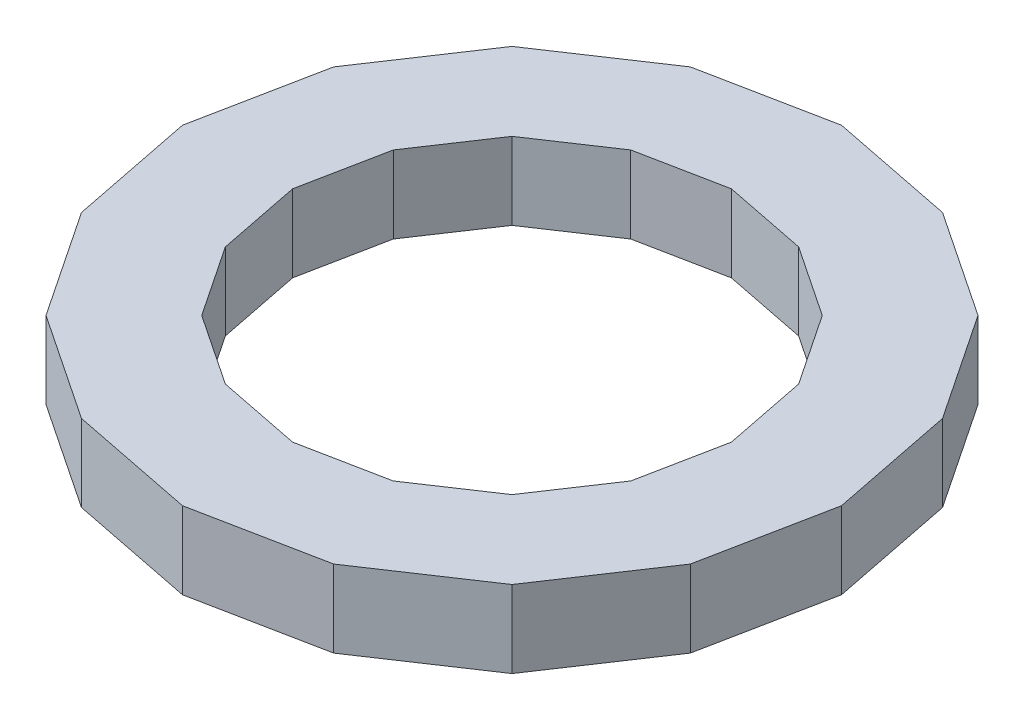
ISO-10303-21;
HEADER;
FILE_DESCRIPTION(('STEP AP214'),'2;1');
FILE_NAME('part.step','',(''),(''),'','','');
FILE_SCHEMA(('AUTOMOTIVE_DESIGN { 1 0 10303 214 1 1 1 1 }'));
ENDSEC;
DATA;
#1=APPLICATION_CONTEXT('core data for automotive mechanical design processes');
#2=APPLICATION_PROTOCOL_DEFINITION('international standard','automotive_design',2000,#1);
#3=PRODUCT_CONTEXT('',#1,'mechanical');
#4=PRODUCT('Part','Part','',(#3));
#5=PRODUCT_RELATED_PRODUCT_CATEGORY('part','',(#4));
#6=PRODUCT_DEFINITION_FORMATION('','',#4);
#7=PRODUCT_DEFINITION_CONTEXT('part definition',#1,'design');
#8=PRODUCT_DEFINITION('design','',#6,#7);
#9=PRODUCT_DEFINITION_SHAPE('','',#8);
#10=(LENGTH_UNIT() NAMED_UNIT(*) SI_UNIT(.MILLI.,.METRE.));
#11=(NAMED_UNIT(*) PLANE_ANGLE_UNIT() SI_UNIT($,.RADIAN.));
#12=(NAMED_UNIT(*) SI_UNIT($,.STERADIAN.) SOLID_ANGLE_UNIT());
#13=UNCERTAINTY_MEASURE_WITH_UNIT(LENGTH_MEASURE(1.E-05),#10,'distance_accuracy_value','');
#14=(GEOMETRIC_REPRESENTATION_CONTEXT(3) GLOBAL_UNCERTAINTY_ASSIGNED_CONTEXT((#13)) GLOBAL_UNIT_ASSIGNED_CONTEXT((#10,
#11,#12)) REPRESENTATION_CONTEXT('',''));
#15=CARTESIAN_POINT('',(0.,0.,0.));
#16=DIRECTION('',(0.,0.,1.));
#17=DIRECTION('',(1.,0.,0.));
#18=AXIS2_PLACEMENT_3D('',#15,#16,#17);
#19=CARTESIAN_POINT('',(0.,19.05,0.));
#20=DIRECTION('',(0.,1.,0.));
#21=DIRECTION('',(0.,0.,1.));
#22=AXIS2_PLACEMENT_3D('',#19,#20,#21);
#23=PLANE('',#22);
#24=DIRECTION('',(-0.195090322016128,0.,0.98078528040323));
#25=VECTOR('',#24,1.);
#26=CARTESIAN_POINT('',(-75.1784477417806,19.05,-31.1399326528026));
#27=LINE('',#26,#25);
#28=CARTESIAN_POINT('',(-75.1784477417806,19.05,-31.1399326528026));
#29=VERTEX_POINT('',#28);
#30=CARTESIAN_POINT('',(-81.3725654657927,19.05,0.));
#31=VERTEX_POINT('',#30);
#32=EDGE_CURVE('E364',#29,#31,#27,.T.);
#33=ORIENTED_EDGE('',*,*,#32,.T.);
#34=DIRECTION('',(0.195090322016128,0.,0.980785280403231));
#35=VECTOR('',#34,1.);
#36=CARTESIAN_POINT('',(-81.3725654657927,19.05,0.));
#37=LINE('',#36,#35);
#38=CARTESIAN_POINT('',(-75.1784477417806,19.05,31.1399326528025));
#39=VERTEX_POINT('',#38);
#40=EDGE_CURVE('E367',#31,#39,#37,.T.);
#41=ORIENTED_EDGE('',*,*,#40,.T.);
#42=DIRECTION('',(0.555570233019602,0.,0.831469612302545));
#43=VECTOR('',#42,1.);
#44=CARTESIAN_POINT('',(-75.1784477417806,19.05,31.1399326528025));
#45=LINE('',#44,#43);
#46=CARTESIAN_POINT('',(-57.5390928434083,19.05,57.5390928434082));
#47=VERTEX_POINT('',#46);
#48=EDGE_CURVE('E370',#39,#47,#45,.T.);
#49=ORIENTED_EDGE('',*,*,#48,.T.);
#50=DIRECTION('',(0.831469612302545,0.,0.555570233019603));
#51=VECTOR('',#50,1.);
#52=CARTESIAN_POINT('',(-57.5390928434083,19.05,57.5390928434082));
#53=LINE('',#52,#51);
#54=CARTESIAN_POINT('',(-31.1399326528025,19.05,75.1784477417806));
#55=VERTEX_POINT('',#54);
#56=EDGE_CURVE('E373',#47,#55,#53,.T.);
#57=ORIENTED_EDGE('',*,*,#56,.T.);
#58=DIRECTION('',(0.980785280403231,0.,0.195090322016128));
#59=VECTOR('',#58,1.);
#60=CARTESIAN_POINT('',(-31.1399326528025,19.05,75.1784477417806));
#61=LINE('',#60,#59);
#62=CARTESIAN_POINT('',(0.,19.05,81.3725654657926));
#63=VERTEX_POINT('',#62);
#64=EDGE_CURVE('E375',#55,#63,#61,.T.);
#65=ORIENTED_EDGE('',*,*,#64,.T.);
#66=DIRECTION('',(0.980785280403231,0.,-0.195090322016128));
#67=VECTOR('',#66,1.);
#68=CARTESIAN_POINT('',(0.,19.05,81.3725654657926));
#69=LINE('',#68,#67);
#70=CARTESIAN_POINT('',(31.1399326528025,19.05,75.1784477417806));
#71=VERTEX_POINT('',#70);
#72=EDGE_CURVE('E377',#63,#71,#69,.T.);
#73=ORIENTED_EDGE('',*,*,#72,.T.);
#74=DIRECTION('',(0.831469612302545,0.,-0.555570233019602));
#75=VECTOR('',#74,1.);
#76=CARTESIAN_POINT('',(31.1399326528025,19.05,75.1784477417806));
#77=LINE('',#76,#75);
#78=CARTESIAN_POINT('',(57.5390928434082,19.05,57.5390928434083));
#79=VERTEX_POINT('',#78);
#80=EDGE_CURVE('E379',#71,#79,#77,.T.);
#81=ORIENTED_EDGE('',*,*,#80,.T.);
#82=DIRECTION('',(0.555570233019603,0.,-0.831469612302545));
#83=VECTOR('',#82,1.);
#84=CARTESIAN_POINT('',(57.5390928434082,19.05,57.5390928434083));
#85=LINE('',#84,#83);
#86=CARTESIAN_POINT('',(75.1784477417806,19.05,31.1399326528025));
#87=VERTEX_POINT('',#86);
#88=EDGE_CURVE('E381',#79,#87,#85,.T.);
#89=ORIENTED_EDGE('',*,*,#88,.T.);
#90=DIRECTION('',(0.195090322016128,0.,-0.98078528040323));
#91=VECTOR('',#90,1.);
#92=CARTESIAN_POINT('',(75.1784477417806,19.05,31.1399326528025));
#93=LINE('',#92,#91);
#94=CARTESIAN_POINT('',(81.3725654657926,19.05,0.));
#95=VERTEX_POINT('',#94);
#96=EDGE_CURVE('E383',#87,#95,#93,.T.);
#97=ORIENTED_EDGE('',*,*,#96,.T.);
#98=DIRECTION('',(-0.195090322016128,0.,-0.98078528040323));
#99=VECTOR('',#98,1.);
#100=CARTESIAN_POINT('',(81.3725654657926,19.05,0.));
#101=LINE('',#100,#99);
#102=CARTESIAN_POINT('',(75.1784477417806,19.05,-31.1399326528025));
#103=VERTEX_POINT('',#102);
#104=EDGE_CURVE('E385',#95,#103,#101,.T.);
#105=ORIENTED_EDGE('',*,*,#104,.T.);
#106=DIRECTION('',(-0.555570233019602,0.,-0.831469612302545));
#107=VECTOR('',#106,1.);
#108=CARTESIAN_POINT('',(75.1784477417806,19.05,-31.1399326528025));
#109=LINE('',#108,#107);
#110=CARTESIAN_POINT('',(57.5390928434083,19.05,-57.5390928434082));
#111=VERTEX_POINT('',#110);
#112=EDGE_CURVE('E387',#103,#111,#109,.T.);
#113=ORIENTED_EDGE('',*,*,#112,.T.);
#114=DIRECTION('',(-0.831469612302545,0.,-0.555570233019603));
#115=VECTOR('',#114,1.);
#116=CARTESIAN_POINT('',(57.5390928434083,19.05,-57.5390928434082));
#117=LINE('',#116,#115);
#118=CARTESIAN_POINT('',(31.1399326528024,19.05,-75.1784477417806));
#119=VERTEX_POINT('',#118);
#120=EDGE_CURVE('E389',#111,#119,#117,.T.);
#121=ORIENTED_EDGE('',*,*,#120,.T.);
#122=DIRECTION('',(-0.980785280403231,0.,-0.195090322016128));
#123=VECTOR('',#122,1.);
#124=CARTESIAN_POINT('',(31.1399326528024,19.05,-75.1784477417806));
#125=LINE('',#124,#123);
#126=CARTESIAN_POINT('',(0.,19.05,-81.3725654657927));
#127=VERTEX_POINT('',#126);
#128=EDGE_CURVE('E391',#119,#127,#125,.T.);
#129=ORIENTED_EDGE('',*,*,#128,.T.);
#130=DIRECTION('',(-0.980785280403231,0.,0.195090322016127));
#131=VECTOR('',#130,1.);
#132=CARTESIAN_POINT('',(0.,19.05,-81.3725654657927));
#133=LINE('',#132,#131);
#134=CARTESIAN_POINT('',(-31.1399326528025,19.05,-75.1784477417806));
#135=VERTEX_POINT('',#134);
#136=EDGE_CURVE('E393',#127,#135,#133,.T.);
#137=ORIENTED_EDGE('',*,*,#136,.T.);
#138=DIRECTION('',(-0.831469612302546,0.,0.555570233019602));
#139=VECTOR('',#138,1.);
#140=CARTESIAN_POINT('',(-31.1399326528025,19.05,-75.1784477417806));
#141=LINE('',#140,#139);
#142=CARTESIAN_POINT('',(-57.5390928434082,19.05,-57.5390928434083));
#143=VERTEX_POINT('',#142);
#144=EDGE_CURVE('E395',#135,#143,#141,.T.);
#145=ORIENTED_EDGE('',*,*,#144,.T.);
#146=DIRECTION('',(-0.555570233019603,0.,0.831469612302545));
#147=VECTOR('',#146,1.);
#148=CARTESIAN_POINT('',(-57.5390928434082,19.05,-57.5390928434083));
#149=LINE('',#148,#147);
#150=EDGE_CURVE('E397',#143,#29,#149,.T.);
#151=ORIENTED_EDGE('',*,*,#150,.T.);
#152=EDGE_LOOP('',(#33,#41,#49,#57,#65,#73,#81,#89,#97,#105,#113,#121,#129,#137,#145,#151));
#153=FACE_BOUND('',#152,.T.);
#154=DIRECTION('',(0.195090322016128,0.,0.98078528040323));
#155=VECTOR('',#154,1.);
#156=CARTESIAN_POINT('',(-54.180069276377,19.05,0.));
#157=LINE('',#156,#155);
#158=CARTESIAN_POINT('',(-54.180069276377,19.05,0.));
#159=VERTEX_POINT('',#158);
#160=CARTESIAN_POINT('',(-50.0558570744883,19.05,20.7338148764623));
#161=VERTEX_POINT('',#160);
#162=EDGE_CURVE('E251',#159,#161,#157,.T.);
#163=ORIENTED_EDGE('',*,*,#162,.F.);
#164=DIRECTION('',(-0.195090322016128,0.,0.98078528040323));
#165=VECTOR('',#164,1.);
#166=CARTESIAN_POINT('',(-50.0558570744883,19.05,-20.7338148764623));
#167=LINE('',#166,#165);
#168=CARTESIAN_POINT('',(-50.0558570744883,19.05,-20.7338148764623));
#169=VERTEX_POINT('',#168);
#170=EDGE_CURVE('E243',#169,#159,#167,.T.);
#171=ORIENTED_EDGE('',*,*,#170,.F.);
#172=DIRECTION('',(-0.555570233019602,0.,0.831469612302546));
#173=VECTOR('',#172,1.);
#174=CARTESIAN_POINT('',(-38.3110943904831,19.05,-38.3110943904831));
#175=LINE('',#174,#173);
#176=CARTESIAN_POINT('',(-38.3110943904831,19.05,-38.3110943904831));
#177=VERTEX_POINT('',#176);
#178=EDGE_CURVE('E292',#177,#169,#175,.T.);
#179=ORIENTED_EDGE('',*,*,#178,.F.);
#180=DIRECTION('',(-0.831469612302545,0.,0.555570233019603));
#181=VECTOR('',#180,1.);
#182=CARTESIAN_POINT('',(-20.7338148764623,19.05,-50.0558570744883));
#183=LINE('',#182,#181);
#184=CARTESIAN_POINT('',(-20.7338148764623,19.05,-50.0558570744883));
#185=VERTEX_POINT('',#184);
#186=EDGE_CURVE('E290',#185,#177,#183,.T.);
#187=ORIENTED_EDGE('',*,*,#186,.F.);
#188=DIRECTION('',(-0.98078528040323,0.,0.195090322016129));
#189=VECTOR('',#188,1.);
#190=CARTESIAN_POINT('',(0.,19.05,-54.180069276377));
#191=LINE('',#190,#189);
#192=CARTESIAN_POINT('',(0.,19.05,-54.180069276377));
#193=VERTEX_POINT('',#192);
#194=EDGE_CURVE('E288',#193,#185,#191,.T.);
#195=ORIENTED_EDGE('',*,*,#194,.F.);
#196=DIRECTION('',(-0.980785280403231,0.,-0.195090322016128));
#197=VECTOR('',#196,1.);
#198=CARTESIAN_POINT('',(20.7338148764623,19.05,-50.0558570744883));
#199=LINE('',#198,#197);
#200=CARTESIAN_POINT('',(20.7338148764623,19.05,-50.0558570744883));
#201=VERTEX_POINT('',#200);
#202=EDGE_CURVE('E286',#201,#193,#199,.T.);
#203=ORIENTED_EDGE('',*,*,#202,.F.);
#204=DIRECTION('',(-0.831469612302545,0.,-0.555570233019602));
#205=VECTOR('',#204,1.);
#206=CARTESIAN_POINT('',(38.3110943904831,19.05,-38.3110943904831));
#207=LINE('',#206,#205);
#208=CARTESIAN_POINT('',(38.3110943904831,19.05,-38.3110943904831));
#209=VERTEX_POINT('',#208);
#210=EDGE_CURVE('E284',#209,#201,#207,.T.);
#211=ORIENTED_EDGE('',*,*,#210,.F.);
#212=DIRECTION('',(-0.555570233019603,0.,-0.831469612302545));
#213=VECTOR('',#212,1.);
#214=CARTESIAN_POINT('',(50.0558570744883,19.05,-20.7338148764623));
#215=LINE('',#214,#213);
#216=CARTESIAN_POINT('',(50.0558570744883,19.05,-20.7338148764623));
#217=VERTEX_POINT('',#216);
#218=EDGE_CURVE('E282',#217,#209,#215,.T.);
#219=ORIENTED_EDGE('',*,*,#218,.F.);
#220=DIRECTION('',(-0.195090322016129,0.,-0.98078528040323));
#221=VECTOR('',#220,1.);
#222=CARTESIAN_POINT('',(54.180069276377,19.05,0.));
#223=LINE('',#222,#221);
#224=CARTESIAN_POINT('',(54.180069276377,19.05,0.));
#225=VERTEX_POINT('',#224);
#226=EDGE_CURVE('E280',#225,#217,#223,.T.);
#227=ORIENTED_EDGE('',*,*,#226,.F.);
#228=DIRECTION('',(0.195090322016128,0.,-0.980785280403231));
#229=VECTOR('',#228,1.);
#230=CARTESIAN_POINT('',(50.0558570744883,19.05,20.7338148764623));
#231=LINE('',#230,#229);
#232=CARTESIAN_POINT('',(50.0558570744883,19.05,20.7338148764623));
#233=VERTEX_POINT('',#232);
#234=EDGE_CURVE('E278',#233,#225,#231,.T.);
#235=ORIENTED_EDGE('',*,*,#234,.F.);
#236=DIRECTION('',(0.555570233019602,0.,-0.831469612302546));
#237=VECTOR('',#236,1.);
#238=CARTESIAN_POINT('',(38.3110943904831,19.05,38.3110943904831));
#239=LINE('',#238,#237);
#240=CARTESIAN_POINT('',(38.3110943904831,19.05,38.3110943904831));
#241=VERTEX_POINT('',#240);
#242=EDGE_CURVE('E276',#241,#233,#239,.T.);
#243=ORIENTED_EDGE('',*,*,#242,.F.);
#244=DIRECTION('',(0.831469612302545,0.,-0.555570233019603));
#245=VECTOR('',#244,1.);
#246=CARTESIAN_POINT('',(20.7338148764623,19.05,50.0558570744883));
#247=LINE('',#246,#245);
#248=CARTESIAN_POINT('',(20.7338148764623,19.05,50.0558570744883));
#249=VERTEX_POINT('',#248);
#250=EDGE_CURVE('E274',#249,#241,#247,.T.);
#251=ORIENTED_EDGE('',*,*,#250,.F.);
#252=DIRECTION('',(0.98078528040323,0.,-0.195090322016129));
#253=VECTOR('',#252,1.);
#254=CARTESIAN_POINT('',(0.,19.05,54.180069276377));
#255=LINE('',#254,#253);
#256=CARTESIAN_POINT('',(0.,19.05,54.180069276377));
#257=VERTEX_POINT('',#256);
#258=EDGE_CURVE('E272',#257,#249,#255,.T.);
#259=ORIENTED_EDGE('',*,*,#258,.F.);
#260=DIRECTION('',(0.98078528040323,0.,0.195090322016128));
#261=VECTOR('',#260,1.);
#262=CARTESIAN_POINT('',(-20.7338148764623,19.05,50.0558570744883));
#263=LINE('',#262,#261);
#264=CARTESIAN_POINT('',(-20.7338148764623,19.05,50.0558570744883));
#265=VERTEX_POINT('',#264);
#266=EDGE_CURVE('E270',#265,#257,#263,.T.);
#267=ORIENTED_EDGE('',*,*,#266,.F.);
#268=DIRECTION('',(0.831469612302546,0.,0.555570233019601));
#269=VECTOR('',#268,1.);
#270=CARTESIAN_POINT('',(-38.3110943904831,19.05,38.3110943904831));
#271=LINE('',#270,#269);
#272=CARTESIAN_POINT('',(-38.3110943904831,19.05,38.3110943904831));
#273=VERTEX_POINT('',#272);
#274=EDGE_CURVE('E266',#273,#265,#271,.T.);
#275=ORIENTED_EDGE('',*,*,#274,.F.);
#276=DIRECTION('',(0.555570233019603,0.,0.831469612302545));
#277=VECTOR('',#276,1.);
#278=CARTESIAN_POINT('',(-50.0558570744883,19.05,20.7338148764623));
#279=LINE('',#278,#277);
#280=EDGE_CURVE('E264',#161,#273,#279,.T.);
#281=ORIENTED_EDGE('',*,*,#280,.F.);
#282=EDGE_LOOP('',(#163,#171,#179,#187,#195,#203,#211,#219,#227,#235,#243,#251,#259,#267,#275,#281));
#283=FACE_BOUND('',#282,.T.);
#284=ADVANCED_FACE('F34',(#153,#283),#23,.T.);
#285=CARTESIAN_POINT('',(0.,0.,0.));
#286=DIRECTION('',(0.,1.,0.));
#287=DIRECTION('',(0.,0.,1.));
#288=AXIS2_PLACEMENT_3D('',#285,#286,#287);
#289=PLANE('',#288);
#290=DIRECTION('',(-0.195090322016128,0.,0.98078528040323));
#291=VECTOR('',#290,1.);
#292=CARTESIAN_POINT('',(-75.1784477417806,0.,-31.1399326528026));
#293=LINE('',#292,#291);
#294=CARTESIAN_POINT('',(-75.1784477417806,0.,-31.1399326528026));
#295=VERTEX_POINT('',#294);
#296=CARTESIAN_POINT('',(-81.3725654657927,0.,0.));
#297=VERTEX_POINT('',#296);
#298=EDGE_CURVE('E259',#295,#297,#293,.T.);
#299=ORIENTED_EDGE('',*,*,#298,.F.);
#300=DIRECTION('',(-0.555570233019603,0.,0.831469612302545));
#301=VECTOR('',#300,1.);
#302=CARTESIAN_POINT('',(-57.5390928434082,0.,-57.5390928434083));
#303=LINE('',#302,#301);
#304=CARTESIAN_POINT('',(-57.5390928434082,0.,-57.5390928434083));
#305=VERTEX_POINT('',#304);
#306=EDGE_CURVE('E368',#305,#295,#303,.T.);
#307=ORIENTED_EDGE('',*,*,#306,.F.);
#308=DIRECTION('',(-0.831469612302546,0.,0.555570233019602));
#309=VECTOR('',#308,1.);
#310=CARTESIAN_POINT('',(-31.1399326528025,0.,-75.1784477417806));
#311=LINE('',#310,#309);
#312=CARTESIAN_POINT('',(-31.1399326528025,0.,-75.1784477417806));
#313=VERTEX_POINT('',#312);
#314=EDGE_CURVE('E428',#313,#305,#311,.T.);
#315=ORIENTED_EDGE('',*,*,#314,.F.);
#316=DIRECTION('',(-0.980785280403231,0.,0.195090322016127));
#317=VECTOR('',#316,1.);
#318=CARTESIAN_POINT('',(0.,0.,-81.3725654657927));
#319=LINE('',#318,#317);
#320=CARTESIAN_POINT('',(0.,0.,-81.3725654657927));
#321=VERTEX_POINT('',#320);
#322=EDGE_CURVE('E426',#321,#313,#319,.T.);
#323=ORIENTED_EDGE('',*,*,#322,.F.);
#324=DIRECTION('',(-0.980785280403231,0.,-0.195090322016128));
#325=VECTOR('',#324,1.);
#326=CARTESIAN_POINT('',(31.1399326528024,0.,-75.1784477417806));
#327=LINE('',#326,#325);
#328=CARTESIAN_POINT('',(31.1399326528024,0.,-75.1784477417806));
#329=VERTEX_POINT('',#328);
#330=EDGE_CURVE('E424',#329,#321,#327,.T.);
#331=ORIENTED_EDGE('',*,*,#330,.F.);
#332=DIRECTION('',(-0.831469612302545,0.,-0.555570233019603));
#333=VECTOR('',#332,1.);
#334=CARTESIAN_POINT('',(57.5390928434083,0.,-57.5390928434082));
#335=LINE('',#334,#333);
#336=CARTESIAN_POINT('',(57.5390928434083,0.,-57.5390928434082));
#337=VERTEX_POINT('',#336);
#338=EDGE_CURVE('E422',#337,#329,#335,.T.);
#339=ORIENTED_EDGE('',*,*,#338,.F.);
#340=DIRECTION('',(-0.555570233019602,0.,-0.831469612302545));
#341=VECTOR('',#340,1.);
#342=CARTESIAN_POINT('',(75.1784477417806,0.,-31.1399326528025));
#343=LINE('',#342,#341);
#344=CARTESIAN_POINT('',(75.1784477417806,0.,-31.1399326528025));
#345=VERTEX_POINT('',#344);
#346=EDGE_CURVE('E420',#345,#337,#343,.T.);
#347=ORIENTED_EDGE('',*,*,#346,.F.);
#348=DIRECTION('',(-0.195090322016128,0.,-0.98078528040323));
#349=VECTOR('',#348,1.);
#350=CARTESIAN_POINT('',(81.3725654657926,0.,0.));
#351=LINE('',#350,#349);
#352=CARTESIAN_POINT('',(81.3725654657926,0.,0.));
#353=VERTEX_POINT('',#352);
#354=EDGE_CURVE('E418',#353,#345,#351,.T.);
#355=ORIENTED_EDGE('',*,*,#354,.F.);
#356=DIRECTION('',(0.195090322016128,0.,-0.98078528040323));
#357=VECTOR('',#356,1.);
#358=CARTESIAN_POINT('',(75.1784477417806,0.,31.1399326528025));
#359=LINE('',#358,#357);
#360=CARTESIAN_POINT('',(75.1784477417806,0.,31.1399326528025));
#361=VERTEX_POINT('',#360);
#362=EDGE_CURVE('E416',#361,#353,#359,.T.);
#363=ORIENTED_EDGE('',*,*,#362,.F.);
#364=DIRECTION('',(0.555570233019603,0.,-0.831469612302545));
#365=VECTOR('',#364,1.);
#366=CARTESIAN_POINT('',(57.5390928434082,0.,57.5390928434083));
#367=LINE('',#366,#365);
#368=CARTESIAN_POINT('',(57.5390928434082,0.,57.5390928434083));
#369=VERTEX_POINT('',#368);
#370=EDGE_CURVE('E414',#369,#361,#367,.T.);
#371=ORIENTED_EDGE('',*,*,#370,.F.);
#372=DIRECTION('',(0.831469612302545,0.,-0.555570233019602));
#373=VECTOR('',#372,1.);
#374=CARTESIAN_POINT('',(31.1399326528025,0.,75.1784477417806));
#375=LINE('',#374,#373);
#376=CARTESIAN_POINT('',(31.1399326528025,0.,75.1784477417806));
#377=VERTEX_POINT('',#376);
#378=EDGE_CURVE('E412',#377,#369,#375,.T.);
#379=ORIENTED_EDGE('',*,*,#378,.F.);
#380=DIRECTION('',(0.980785280403231,0.,-0.195090322016128));
#381=VECTOR('',#380,1.);
#382=CARTESIAN_POINT('',(0.,0.,81.3725654657926));
#383=LINE('',#382,#381);
#384=CARTESIAN_POINT('',(0.,0.,81.3725654657926));
#385=VERTEX_POINT('',#384);
#386=EDGE_CURVE('E410',#385,#377,#383,.T.);
#387=ORIENTED_EDGE('',*,*,#386,.F.);
#388=DIRECTION('',(0.980785280403231,0.,0.195090322016128));
#389=VECTOR('',#388,1.);
#390=CARTESIAN_POINT('',(-31.1399326528025,0.,75.1784477417806));
#391=LINE('',#390,#389);
#392=CARTESIAN_POINT('',(-31.1399326528025,0.,75.1784477417806));
#393=VERTEX_POINT('',#392);
#394=EDGE_CURVE('E408',#393,#385,#391,.T.);
#395=ORIENTED_EDGE('',*,*,#394,.F.);
#396=DIRECTION('',(0.831469612302545,0.,0.555570233019603));
#397=VECTOR('',#396,1.);
#398=CARTESIAN_POINT('',(-57.5390928434083,0.,57.5390928434082));
#399=LINE('',#398,#397);
#400=CARTESIAN_POINT('',(-57.5390928434083,0.,57.5390928434082));
#401=VERTEX_POINT('',#400);
#402=EDGE_CURVE('E406',#401,#393,#399,.T.);
#403=ORIENTED_EDGE('',*,*,#402,.F.);
#404=DIRECTION('',(0.555570233019602,0.,0.831469612302545));
#405=VECTOR('',#404,1.);
#406=CARTESIAN_POINT('',(-75.1784477417806,0.,31.1399326528025));
#407=LINE('',#406,#405);
#408=CARTESIAN_POINT('',(-75.1784477417806,0.,31.1399326528025));
#409=VERTEX_POINT('',#408);
#410=EDGE_CURVE('E404',#409,#401,#407,.T.);
#411=ORIENTED_EDGE('',*,*,#410,.F.);
#412=DIRECTION('',(0.195090322016128,0.,0.980785280403231));
#413=VECTOR('',#412,1.);
#414=CARTESIAN_POINT('',(-81.3725654657927,0.,0.));
#415=LINE('',#414,#413);
#416=EDGE_CURVE('E402',#297,#409,#415,.T.);
#417=ORIENTED_EDGE('',*,*,#416,.F.);
#418=EDGE_LOOP('',(#299,#307,#315,#323,#331,#339,#347,#355,#363,#371,#379,#387,#395,#403,#411,#417));
#419=FACE_BOUND('',#418,.T.);
#420=DIRECTION('',(-0.195090322016128,0.,0.98078528040323));
#421=VECTOR('',#420,1.);
#422=CARTESIAN_POINT('',(-50.0558570744883,0.,-20.7338148764623));
#423=LINE('',#422,#421);
#424=CARTESIAN_POINT('',(-50.0558570744883,0.,-20.7338148764623));
#425=VERTEX_POINT('',#424);
#426=CARTESIAN_POINT('',(-54.180069276377,0.,0.));
#427=VERTEX_POINT('',#426);
#428=EDGE_CURVE('E57',#425,#427,#423,.T.);
#429=ORIENTED_EDGE('',*,*,#428,.T.);
#430=DIRECTION('',(0.195090322016128,0.,0.98078528040323));
#431=VECTOR('',#430,1.);
#432=CARTESIAN_POINT('',(-54.180069276377,0.,0.));
#433=LINE('',#432,#431);
#434=CARTESIAN_POINT('',(-50.0558570744883,0.,20.7338148764623));
#435=VERTEX_POINT('',#434);
#436=EDGE_CURVE('E258',#427,#435,#433,.T.);
#437=ORIENTED_EDGE('',*,*,#436,.T.);
#438=DIRECTION('',(0.555570233019603,0.,0.831469612302545));
#439=VECTOR('',#438,1.);
#440=CARTESIAN_POINT('',(-50.0558570744883,0.,20.7338148764623));
#441=LINE('',#440,#439);
#442=CARTESIAN_POINT('',(-38.3110943904831,0.,38.3110943904831));
#443=VERTEX_POINT('',#442);
#444=EDGE_CURVE('E296',#435,#443,#441,.T.);
#445=ORIENTED_EDGE('',*,*,#444,.T.);
#446=DIRECTION('',(0.831469612302546,0.,0.555570233019601));
#447=VECTOR('',#446,1.);
#448=CARTESIAN_POINT('',(-38.3110943904831,0.,38.3110943904831));
#449=LINE('',#448,#447);
#450=CARTESIAN_POINT('',(-20.7338148764623,0.,50.0558570744883));
#451=VERTEX_POINT('',#450);
#452=EDGE_CURVE('E299',#443,#451,#449,.T.);
#453=ORIENTED_EDGE('',*,*,#452,.T.);
#454=DIRECTION('',(0.98078528040323,0.,0.195090322016128));
#455=VECTOR('',#454,1.);
#456=CARTESIAN_POINT('',(-20.7338148764623,0.,50.0558570744883));
#457=LINE('',#456,#455);
#458=CARTESIAN_POINT('',(0.,0.,54.180069276377));
#459=VERTEX_POINT('',#458);
#460=EDGE_CURVE('E302',#451,#459,#457,.T.);
#461=ORIENTED_EDGE('',*,*,#460,.T.);
#462=DIRECTION('',(0.98078528040323,0.,-0.195090322016129));
#463=VECTOR('',#462,1.);
#464=CARTESIAN_POINT('',(0.,0.,54.180069276377));
#465=LINE('',#464,#463);
#466=CARTESIAN_POINT('',(20.7338148764623,0.,50.0558570744883));
#467=VERTEX_POINT('',#466);
#468=EDGE_CURVE('E305',#459,#467,#465,.T.);
#469=ORIENTED_EDGE('',*,*,#468,.T.);
#470=DIRECTION('',(0.831469612302545,0.,-0.555570233019603));
#471=VECTOR('',#470,1.);
#472=CARTESIAN_POINT('',(20.7338148764623,0.,50.0558570744883));
#473=LINE('',#472,#471);
#474=CARTESIAN_POINT('',(38.3110943904831,0.,38.3110943904831));
#475=VERTEX_POINT('',#474);
#476=EDGE_CURVE('E308',#467,#475,#473,.T.);
#477=ORIENTED_EDGE('',*,*,#476,.T.);
#478=DIRECTION('',(0.555570233019602,0.,-0.831469612302546));
#479=VECTOR('',#478,1.);
#480=CARTESIAN_POINT('',(38.3110943904831,0.,38.3110943904831));
#481=LINE('',#480,#479);
#482=CARTESIAN_POINT('',(50.0558570744883,0.,20.7338148764623));
#483=VERTEX_POINT('',#482);
#484=EDGE_CURVE('E311',#475,#483,#481,.T.);
#485=ORIENTED_EDGE('',*,*,#484,.T.);
#486=DIRECTION('',(0.195090322016128,0.,-0.980785280403231));
#487=VECTOR('',#486,1.);
#488=CARTESIAN_POINT('',(50.0558570744883,0.,20.7338148764623));
#489=LINE('',#488,#487);
#490=CARTESIAN_POINT('',(54.180069276377,0.,0.));
#491=VERTEX_POINT('',#490);
#492=EDGE_CURVE('E314',#483,#491,#489,.T.);
#493=ORIENTED_EDGE('',*,*,#492,.T.);
#494=DIRECTION('',(-0.195090322016129,0.,-0.98078528040323));
#495=VECTOR('',#494,1.);
#496=CARTESIAN_POINT('',(54.180069276377,0.,0.));
#497=LINE('',#496,#495);
#498=CARTESIAN_POINT('',(50.0558570744883,0.,-20.7338148764623));
#499=VERTEX_POINT('',#498);
#500=EDGE_CURVE('E317',#491,#499,#497,.T.);
#501=ORIENTED_EDGE('',*,*,#500,.T.);
#502=DIRECTION('',(-0.555570233019603,0.,-0.831469612302545));
#503=VECTOR('',#502,1.);
#504=CARTESIAN_POINT('',(50.0558570744883,0.,-20.7338148764623));
#505=LINE('',#504,#503);
#506=CARTESIAN_POINT('',(38.3110943904831,0.,-38.3110943904831));
#507=VERTEX_POINT('',#506);
#508=EDGE_CURVE('E320',#499,#507,#505,.T.);
#509=ORIENTED_EDGE('',*,*,#508,.T.);
#510=DIRECTION('',(-0.831469612302545,0.,-0.555570233019602));
#511=VECTOR('',#510,1.);
#512=CARTESIAN_POINT('',(38.3110943904831,0.,-38.3110943904831));
#513=LINE('',#512,#511);
#514=CARTESIAN_POINT('',(20.7338148764623,0.,-50.0558570744883));
#515=VERTEX_POINT('',#514);
#516=EDGE_CURVE('E323',#507,#515,#513,.T.);
#517=ORIENTED_EDGE('',*,*,#516,.T.);
#518=DIRECTION('',(-0.980785280403231,0.,-0.195090322016128));
#519=VECTOR('',#518,1.);
#520=CARTESIAN_POINT('',(20.7338148764623,0.,-50.0558570744883));
#521=LINE('',#520,#519);
#522=CARTESIAN_POINT('',(0.,0.,-54.180069276377));
#523=VERTEX_POINT('',#522);
#524=EDGE_CURVE('E326',#515,#523,#521,.T.);
#525=ORIENTED_EDGE('',*,*,#524,.T.);
#526=DIRECTION('',(-0.98078528040323,0.,0.195090322016129));
#527=VECTOR('',#526,1.);
#528=CARTESIAN_POINT('',(0.,0.,-54.180069276377));
#529=LINE('',#528,#527);
#530=CARTESIAN_POINT('',(-20.7338148764623,0.,-50.0558570744883));
#531=VERTEX_POINT('',#530);
#532=EDGE_CURVE('E329',#523,#531,#529,.T.);
#533=ORIENTED_EDGE('',*,*,#532,.T.);
#534=DIRECTION('',(-0.831469612302545,0.,0.555570233019603));
#535=VECTOR('',#534,1.);
#536=CARTESIAN_POINT('',(-20.7338148764623,0.,-50.0558570744883));
#537=LINE('',#536,#535);
#538=CARTESIAN_POINT('',(-38.3110943904831,0.,-38.3110943904831));
#539=VERTEX_POINT('',#538);
#540=EDGE_CURVE('E332',#531,#539,#537,.T.);
#541=ORIENTED_EDGE('',*,*,#540,.T.);
#542=DIRECTION('',(-0.555570233019602,0.,0.831469612302546));
#543=VECTOR('',#542,1.);
#544=CARTESIAN_POINT('',(-38.3110943904831,0.,-38.3110943904831));
#545=LINE('',#544,#543);
#546=EDGE_CURVE('E252',#539,#425,#545,.T.);
#547=ORIENTED_EDGE('',*,*,#546,.T.);
#548=EDGE_LOOP('',(#429,#437,#445,#453,#461,#469,#477,#485,#493,#501,#509,#517,#525,#533,#541,#547));
#549=FACE_BOUND('',#548,.T.);
#550=ADVANCED_FACE('F482',(#419,#549),#289,.F.);
#551=CARTESIAN_POINT('',(-75.1784477417806,19.05,-31.1399326528026));
#552=DIRECTION('',(0.980785280403231,0.,0.195090322016128));
#553=DIRECTION('',(0.195090322016128,0.,-0.98078528040323));
#554=AXIS2_PLACEMENT_3D('',#551,#552,#553);
#555=PLANE('',#554);
#556=ORIENTED_EDGE('',*,*,#298,.T.);
#557=DIRECTION('',(0.,-1.,0.));
#558=VECTOR('',#557,1.);
#559=CARTESIAN_POINT('',(-81.3725654657927,19.05,0.));
#560=LINE('',#559,#558);
#561=EDGE_CURVE('E11',#31,#297,#560,.T.);
#562=ORIENTED_EDGE('',*,*,#561,.F.);
#563=ORIENTED_EDGE('',*,*,#32,.F.);
#564=DIRECTION('',(0.,-1.,0.));
#565=VECTOR('',#564,1.);
#566=CARTESIAN_POINT('',(-75.1784477417806,19.05,-31.1399326528026));
#567=LINE('',#566,#565);
#568=EDGE_CURVE('E399',#29,#295,#567,.T.);
#569=ORIENTED_EDGE('',*,*,#568,.T.);
#570=EDGE_LOOP('',(#556,#562,#563,#569));
#571=FACE_BOUND('',#570,.T.);
#572=ADVANCED_FACE('F36',(#571),#555,.F.);
#573=CARTESIAN_POINT('',(-81.3725654657927,19.05,0.));
#574=DIRECTION('',(0.98078528040323,0.,-0.195090322016128));
#575=DIRECTION('',(-0.195090322016128,0.,-0.980785280403231));
#576=AXIS2_PLACEMENT_3D('',#573,#574,#575);
#577=PLANE('',#576);
#578=ORIENTED_EDGE('',*,*,#416,.T.);
#579=DIRECTION('',(0.,-1.,0.));
#580=VECTOR('',#579,1.);
#581=CARTESIAN_POINT('',(-75.1784477417806,19.05,31.1399326528025));
#582=LINE('',#581,#580);
#583=EDGE_CURVE('E42',#39,#409,#582,.T.);
#584=ORIENTED_EDGE('',*,*,#583,.F.);
#585=ORIENTED_EDGE('',*,*,#40,.F.);
#586=ORIENTED_EDGE('',*,*,#561,.T.);
#587=EDGE_LOOP('',(#578,#584,#585,#586));
#588=FACE_BOUND('',#587,.T.);
#589=ADVANCED_FACE('F499',(#588),#577,.F.);
#590=CARTESIAN_POINT('',(-75.1784477417806,19.05,31.1399326528025));
#591=DIRECTION('',(0.831469612302546,0.,-0.555570233019602));
#592=DIRECTION('',(-0.555570233019602,0.,-0.831469612302546));
#593=AXIS2_PLACEMENT_3D('',#590,#591,#592);
#594=PLANE('',#593);
#595=ORIENTED_EDGE('',*,*,#410,.T.);
#596=DIRECTION('',(0.,-1.,0.));
#597=VECTOR('',#596,1.);
#598=CARTESIAN_POINT('',(-57.5390928434083,19.05,57.5390928434082));
#599=LINE('',#598,#597);
#600=EDGE_CURVE('E469',#47,#401,#599,.T.);
#601=ORIENTED_EDGE('',*,*,#600,.F.);
#602=ORIENTED_EDGE('',*,*,#48,.F.);
#603=ORIENTED_EDGE('',*,*,#583,.T.);
#604=EDGE_LOOP('',(#595,#601,#602,#603));
#605=FACE_BOUND('',#604,.T.);
#606=ADVANCED_FACE('F476',(#605),#594,.F.);
#607=CARTESIAN_POINT('',(-57.5390928434083,19.05,57.5390928434082));
#608=DIRECTION('',(0.555570233019603,0.,-0.831469612302545));
#609=DIRECTION('',(-0.831469612302545,0.,-0.555570233019603));
#610=AXIS2_PLACEMENT_3D('',#607,#608,#609);
#611=PLANE('',#610);
#612=ORIENTED_EDGE('',*,*,#402,.T.);
#613=DIRECTION('',(0.,-1.,0.));
#614=VECTOR('',#613,1.);
#615=CARTESIAN_POINT('',(-31.1399326528025,19.05,75.1784477417806));
#616=LINE('',#615,#614);
#617=EDGE_CURVE('E466',#55,#393,#616,.T.);
#618=ORIENTED_EDGE('',*,*,#617,.F.);
#619=ORIENTED_EDGE('',*,*,#56,.F.);
#620=ORIENTED_EDGE('',*,*,#600,.T.);
#621=EDGE_LOOP('',(#612,#618,#619,#620));
#622=FACE_BOUND('',#621,.T.);
#623=ADVANCED_FACE('F488',(#622),#611,.F.);
#624=CARTESIAN_POINT('',(-31.1399326528025,19.05,75.1784477417806));
#625=DIRECTION('',(0.195090322016128,0.,-0.980785280403231));
#626=DIRECTION('',(-0.980785280403231,0.,-0.195090322016128));
#627=AXIS2_PLACEMENT_3D('',#624,#625,#626);
#628=PLANE('',#627);
#629=ORIENTED_EDGE('',*,*,#394,.T.);
#630=DIRECTION('',(0.,-1.,0.));
#631=VECTOR('',#630,1.);
#632=CARTESIAN_POINT('',(0.,19.05,81.3725654657926));
#633=LINE('',#632,#631);
#634=EDGE_CURVE('E463',#63,#385,#633,.T.);
#635=ORIENTED_EDGE('',*,*,#634,.F.);
#636=ORIENTED_EDGE('',*,*,#64,.F.);
#637=ORIENTED_EDGE('',*,*,#617,.T.);
#638=EDGE_LOOP('',(#629,#635,#636,#637));
#639=FACE_BOUND('',#638,.T.);
#640=ADVANCED_FACE('F492',(#639),#628,.F.);
#641=CARTESIAN_POINT('',(0.,19.05,81.3725654657926));
#642=DIRECTION('',(-0.195090322016127,0.,-0.980785280403231));
#643=DIRECTION('',(-0.980785280403231,0.,0.195090322016128));
#644=AXIS2_PLACEMENT_3D('',#641,#642,#643);
#645=PLANE('',#644);
#646=ORIENTED_EDGE('',*,*,#386,.T.);
#647=DIRECTION('',(0.,-1.,0.));
#648=VECTOR('',#647,1.);
#649=CARTESIAN_POINT('',(31.1399326528025,19.05,75.1784477417806));
#650=LINE('',#649,#648);
#651=EDGE_CURVE('E460',#71,#377,#650,.T.);
#652=ORIENTED_EDGE('',*,*,#651,.F.);
#653=ORIENTED_EDGE('',*,*,#72,.F.);
#654=ORIENTED_EDGE('',*,*,#634,.T.);
#655=EDGE_LOOP('',(#646,#652,#653,#654));
#656=FACE_BOUND('',#655,.T.);
#657=ADVANCED_FACE('F552',(#656),#645,.F.);
#658=CARTESIAN_POINT('',(31.1399326528025,19.05,75.1784477417806));
#659=DIRECTION('',(-0.555570233019602,0.,-0.831469612302545));
#660=DIRECTION('',(-0.831469612302545,0.,0.555570233019602));
#661=AXIS2_PLACEMENT_3D('',#658,#659,#660);
#662=PLANE('',#661);
#663=ORIENTED_EDGE('',*,*,#378,.T.);
#664=DIRECTION('',(0.,-1.,0.));
#665=VECTOR('',#664,1.);
#666=CARTESIAN_POINT('',(57.5390928434082,19.05,57.5390928434083));
#667=LINE('',#666,#665);
#668=EDGE_CURVE('E457',#79,#369,#667,.T.);
#669=ORIENTED_EDGE('',*,*,#668,.F.);
#670=ORIENTED_EDGE('',*,*,#80,.F.);
#671=ORIENTED_EDGE('',*,*,#651,.T.);
#672=EDGE_LOOP('',(#663,#669,#670,#671));
#673=FACE_BOUND('',#672,.T.);
#674=ADVANCED_FACE('F549',(#673),#662,.F.);
#675=CARTESIAN_POINT('',(57.5390928434082,19.05,57.5390928434083));
#676=DIRECTION('',(-0.831469612302545,0.,-0.555570233019603));
#677=DIRECTION('',(-0.555570233019603,0.,0.831469612302545));
#678=AXIS2_PLACEMENT_3D('',#675,#676,#677);
#679=PLANE('',#678);
#680=ORIENTED_EDGE('',*,*,#370,.T.);
#681=DIRECTION('',(0.,-1.,0.));
#682=VECTOR('',#681,1.);
#683=CARTESIAN_POINT('',(75.1784477417806,19.05,31.1399326528025));
#684=LINE('',#683,#682);
#685=EDGE_CURVE('E454',#87,#361,#684,.T.);
#686=ORIENTED_EDGE('',*,*,#685,.F.);
#687=ORIENTED_EDGE('',*,*,#88,.F.);
#688=ORIENTED_EDGE('',*,*,#668,.T.);
#689=EDGE_LOOP('',(#680,#686,#687,#688));
#690=FACE_BOUND('',#689,.T.);
#691=ADVANCED_FACE('F545',(#690),#679,.F.);
#692=CARTESIAN_POINT('',(75.1784477417806,19.05,31.1399326528025));
#693=DIRECTION('',(-0.980785280403231,0.,-0.195090322016128));
#694=DIRECTION('',(-0.195090322016128,0.,0.98078528040323));
#695=AXIS2_PLACEMENT_3D('',#692,#693,#694);
#696=PLANE('',#695);
#697=ORIENTED_EDGE('',*,*,#362,.T.);
#698=DIRECTION('',(0.,-1.,0.));
#699=VECTOR('',#698,1.);
#700=CARTESIAN_POINT('',(81.3725654657926,19.05,0.));
#701=LINE('',#700,#699);
#702=EDGE_CURVE('E451',#95,#353,#701,.T.);
#703=ORIENTED_EDGE('',*,*,#702,.F.);
#704=ORIENTED_EDGE('',*,*,#96,.F.);
#705=ORIENTED_EDGE('',*,*,#685,.T.);
#706=EDGE_LOOP('',(#697,#703,#704,#705));
#707=FACE_BOUND('',#706,.T.);
#708=ADVANCED_FACE('F541',(#707),#696,.F.);
#709=CARTESIAN_POINT('',(81.3725654657926,19.05,0.));
#710=DIRECTION('',(-0.980785280403231,0.,0.195090322016128));
#711=DIRECTION('',(0.195090322016128,0.,0.980785280403231));
#712=AXIS2_PLACEMENT_3D('',#709,#710,#711);
#713=PLANE('',#712);
#714=ORIENTED_EDGE('',*,*,#354,.T.);
#715=DIRECTION('',(0.,-1.,0.));
#716=VECTOR('',#715,1.);
#717=CARTESIAN_POINT('',(75.1784477417806,19.05,-31.1399326528025));
#718=LINE('',#717,#716);
#719=EDGE_CURVE('E448',#103,#345,#718,.T.);
#720=ORIENTED_EDGE('',*,*,#719,.F.);
#721=ORIENTED_EDGE('',*,*,#104,.F.);
#722=ORIENTED_EDGE('',*,*,#702,.T.);
#723=EDGE_LOOP('',(#714,#720,#721,#722));
#724=FACE_BOUND('',#723,.T.);
#725=ADVANCED_FACE('F536',(#724),#713,.F.);
#726=CARTESIAN_POINT('',(75.1784477417806,19.05,-31.1399326528025));
#727=DIRECTION('',(-0.831469612302545,0.,0.555570233019602));
#728=DIRECTION('',(0.555570233019602,0.,0.831469612302545));
#729=AXIS2_PLACEMENT_3D('',#726,#727,#728);
#730=PLANE('',#729);
#731=ORIENTED_EDGE('',*,*,#346,.T.);
#732=DIRECTION('',(0.,-1.,0.));
#733=VECTOR('',#732,1.);
#734=CARTESIAN_POINT('',(57.5390928434083,19.05,-57.5390928434082));
#735=LINE('',#734,#733);
#736=EDGE_CURVE('E445',#111,#337,#735,.T.);
#737=ORIENTED_EDGE('',*,*,#736,.F.);
#738=ORIENTED_EDGE('',*,*,#112,.F.);
#739=ORIENTED_EDGE('',*,*,#719,.T.);
#740=EDGE_LOOP('',(#731,#737,#738,#739));
#741=FACE_BOUND('',#740,.T.);
#742=ADVANCED_FACE('F530',(#741),#730,.F.);
#743=CARTESIAN_POINT('',(57.5390928434083,19.05,-57.5390928434082));
#744=DIRECTION('',(-0.555570233019603,0.,0.831469612302545));
#745=DIRECTION('',(0.831469612302545,0.,0.555570233019603));
#746=AXIS2_PLACEMENT_3D('',#743,#744,#745);
#747=PLANE('',#746);
#748=ORIENTED_EDGE('',*,*,#338,.T.);
#749=DIRECTION('',(0.,-1.,0.));
#750=VECTOR('',#749,1.);
#751=CARTESIAN_POINT('',(31.1399326528024,19.05,-75.1784477417806));
#752=LINE('',#751,#750);
#753=EDGE_CURVE('E442',#119,#329,#752,.T.);
#754=ORIENTED_EDGE('',*,*,#753,.F.);
#755=ORIENTED_EDGE('',*,*,#120,.F.);
#756=ORIENTED_EDGE('',*,*,#736,.T.);
#757=EDGE_LOOP('',(#748,#754,#755,#756));
#758=FACE_BOUND('',#757,.T.);
#759=ADVANCED_FACE('F526',(#758),#747,.F.);
#760=CARTESIAN_POINT('',(31.1399326528024,19.05,-75.1784477417806));
#761=DIRECTION('',(-0.195090322016128,0.,0.980785280403231));
#762=DIRECTION('',(0.980785280403231,0.,0.195090322016128));
#763=AXIS2_PLACEMENT_3D('',#760,#761,#762);
#764=PLANE('',#763);
#765=ORIENTED_EDGE('',*,*,#330,.T.);
#766=DIRECTION('',(0.,-1.,0.));
#767=VECTOR('',#766,1.);
#768=CARTESIAN_POINT('',(0.,19.05,-81.3725654657927));
#769=LINE('',#768,#767);
#770=EDGE_CURVE('E439',#127,#321,#769,.T.);
#771=ORIENTED_EDGE('',*,*,#770,.F.);
#772=ORIENTED_EDGE('',*,*,#128,.F.);
#773=ORIENTED_EDGE('',*,*,#753,.T.);
#774=EDGE_LOOP('',(#765,#771,#772,#773));
#775=FACE_BOUND('',#774,.T.);
#776=ADVANCED_FACE('F521',(#775),#764,.F.);
#777=CARTESIAN_POINT('',(0.,19.05,-81.3725654657927));
#778=DIRECTION('',(0.195090322016127,0.,0.980785280403231));
#779=DIRECTION('',(0.980785280403231,0.,-0.195090322016128));
#780=AXIS2_PLACEMENT_3D('',#777,#778,#779);
#781=PLANE('',#780);
#782=ORIENTED_EDGE('',*,*,#322,.T.);
#783=DIRECTION('',(0.,-1.,0.));
#784=VECTOR('',#783,1.);
#785=CARTESIAN_POINT('',(-31.1399326528025,19.05,-75.1784477417806));
#786=LINE('',#785,#784);
#787=EDGE_CURVE('E436',#135,#313,#786,.T.);
#788=ORIENTED_EDGE('',*,*,#787,.F.);
#789=ORIENTED_EDGE('',*,*,#136,.F.);
#790=ORIENTED_EDGE('',*,*,#770,.T.);
#791=EDGE_LOOP('',(#782,#788,#789,#790));
#792=FACE_BOUND('',#791,.T.);
#793=ADVANCED_FACE('F515',(#792),#781,.F.);
#794=CARTESIAN_POINT('',(-31.1399326528025,19.05,-75.1784477417806));
#795=DIRECTION('',(0.555570233019602,0.,0.831469612302546));
#796=DIRECTION('',(0.831469612302546,0.,-0.555570233019602));
#797=AXIS2_PLACEMENT_3D('',#794,#795,#796);
#798=PLANE('',#797);
#799=ORIENTED_EDGE('',*,*,#314,.T.);
#800=DIRECTION('',(0.,-1.,0.));
#801=VECTOR('',#800,1.);
#802=CARTESIAN_POINT('',(-57.5390928434082,19.05,-57.5390928434083));
#803=LINE('',#802,#801);
#804=EDGE_CURVE('E433',#143,#305,#803,.T.);
#805=ORIENTED_EDGE('',*,*,#804,.F.);
#806=ORIENTED_EDGE('',*,*,#144,.F.);
#807=ORIENTED_EDGE('',*,*,#787,.T.);
#808=EDGE_LOOP('',(#799,#805,#806,#807));
#809=FACE_BOUND('',#808,.T.);
#810=ADVANCED_FACE('F511',(#809),#798,.F.);
#811=CARTESIAN_POINT('',(-57.5390928434082,19.05,-57.5390928434083));
#812=DIRECTION('',(0.831469612302545,0.,0.555570233019603));
#813=DIRECTION('',(0.555570233019603,0.,-0.831469612302545));
#814=AXIS2_PLACEMENT_3D('',#811,#812,#813);
#815=PLANE('',#814);
#816=ORIENTED_EDGE('',*,*,#306,.T.);
#817=ORIENTED_EDGE('',*,*,#568,.F.);
#818=ORIENTED_EDGE('',*,*,#150,.F.);
#819=ORIENTED_EDGE('',*,*,#804,.T.);
#820=EDGE_LOOP('',(#816,#817,#818,#819));
#821=FACE_BOUND('',#820,.T.);
#822=ADVANCED_FACE('F506',(#821),#815,.F.);
#823=CARTESIAN_POINT('',(-50.0558570744883,19.05,-20.7338148764623));
#824=DIRECTION('',(0.98078528040323,0.,0.195090322016128));
#825=DIRECTION('',(0.195090322016128,0.,-0.980785280403231));
#826=AXIS2_PLACEMENT_3D('',#823,#824,#825);
#827=PLANE('',#826);
#828=ORIENTED_EDGE('',*,*,#428,.F.);
#829=DIRECTION('',(0.,-1.,0.));
#830=VECTOR('',#829,1.);
#831=CARTESIAN_POINT('',(-50.0558570744883,19.05,-20.7338148764623));
#832=LINE('',#831,#830);
#833=EDGE_CURVE('E247',#169,#425,#832,.T.);
#834=ORIENTED_EDGE('',*,*,#833,.F.);
#835=ORIENTED_EDGE('',*,*,#170,.T.);
#836=DIRECTION('',(0.,-1.,0.));
#837=VECTOR('',#836,1.);
#838=CARTESIAN_POINT('',(-54.180069276377,19.05,0.));
#839=LINE('',#838,#837);
#840=EDGE_CURVE('E246',#159,#427,#839,.T.);
#841=ORIENTED_EDGE('',*,*,#840,.T.);
#842=EDGE_LOOP('',(#828,#834,#835,#841));
#843=FACE_BOUND('',#842,.T.);
#844=ADVANCED_FACE('F245',(#843),#827,.T.);
#845=CARTESIAN_POINT('',(-54.180069276377,19.05,0.));
#846=DIRECTION('',(0.980785280403231,0.,-0.195090322016128));
#847=DIRECTION('',(-0.195090322016128,0.,-0.98078528040323));
#848=AXIS2_PLACEMENT_3D('',#845,#846,#847);
#849=PLANE('',#848);
#850=ORIENTED_EDGE('',*,*,#436,.F.);
#851=ORIENTED_EDGE('',*,*,#840,.F.);
#852=ORIENTED_EDGE('',*,*,#162,.T.);
#853=DIRECTION('',(0.,-1.,0.));
#854=VECTOR('',#853,1.);
#855=CARTESIAN_POINT('',(-50.0558570744883,19.05,20.7338148764623));
#856=LINE('',#855,#854);
#857=EDGE_CURVE('E260',#161,#435,#856,.T.);
#858=ORIENTED_EDGE('',*,*,#857,.T.);
#859=EDGE_LOOP('',(#850,#851,#852,#858));
#860=FACE_BOUND('',#859,.T.);
#861=ADVANCED_FACE('F255',(#860),#849,.T.);
#862=CARTESIAN_POINT('',(-50.0558570744883,19.05,20.7338148764623));
#863=DIRECTION('',(0.831469612302545,0.,-0.555570233019603));
#864=DIRECTION('',(-0.555570233019603,0.,-0.831469612302545));
#865=AXIS2_PLACEMENT_3D('',#862,#863,#864);
#866=PLANE('',#865);
#867=ORIENTED_EDGE('',*,*,#444,.F.);
#868=ORIENTED_EDGE('',*,*,#857,.F.);
#869=ORIENTED_EDGE('',*,*,#280,.T.);
#870=DIRECTION('',(0.,-1.,0.));
#871=VECTOR('',#870,1.);
#872=CARTESIAN_POINT('',(-38.3110943904831,19.05,38.3110943904831));
#873=LINE('',#872,#871);
#874=EDGE_CURVE('E361',#273,#443,#873,.T.);
#875=ORIENTED_EDGE('',*,*,#874,.T.);
#876=EDGE_LOOP('',(#867,#868,#869,#875));
#877=FACE_BOUND('',#876,.T.);
#878=ADVANCED_FACE('F634',(#877),#866,.T.);
#879=CARTESIAN_POINT('',(-38.3110943904831,19.05,38.3110943904831));
#880=DIRECTION('',(0.555570233019601,0.,-0.831469612302546));
#881=DIRECTION('',(-0.831469612302546,0.,-0.555570233019601));
#882=AXIS2_PLACEMENT_3D('',#879,#880,#881);
#883=PLANE('',#882);
#884=ORIENTED_EDGE('',*,*,#452,.F.);
#885=ORIENTED_EDGE('',*,*,#874,.F.);
#886=ORIENTED_EDGE('',*,*,#274,.T.);
#887=DIRECTION('',(0.,-1.,0.));
#888=VECTOR('',#887,1.);
#889=CARTESIAN_POINT('',(-20.7338148764623,19.05,50.0558570744883));
#890=LINE('',#889,#888);
#891=EDGE_CURVE('E359',#265,#451,#890,.T.);
#892=ORIENTED_EDGE('',*,*,#891,.T.);
#893=EDGE_LOOP('',(#884,#885,#886,#892));
#894=FACE_BOUND('',#893,.T.);
#895=ADVANCED_FACE('F640',(#894),#883,.T.);
#896=CARTESIAN_POINT('',(-20.7338148764623,19.05,50.0558570744883));
#897=DIRECTION('',(0.195090322016128,0.,-0.980785280403231));
#898=DIRECTION('',(-0.98078528040323,0.,-0.195090322016128));
#899=AXIS2_PLACEMENT_3D('',#896,#897,#898);
#900=PLANE('',#899);
#901=ORIENTED_EDGE('',*,*,#460,.F.);
#902=ORIENTED_EDGE('',*,*,#891,.F.);
#903=ORIENTED_EDGE('',*,*,#266,.T.);
#904=DIRECTION('',(0.,-1.,0.));
#905=VECTOR('',#904,1.);
#906=CARTESIAN_POINT('',(0.,19.05,54.180069276377));
#907=LINE('',#906,#905);
#908=EDGE_CURVE('E357',#257,#459,#907,.T.);
#909=ORIENTED_EDGE('',*,*,#908,.T.);
#910=EDGE_LOOP('',(#901,#902,#903,#909));
#911=FACE_BOUND('',#910,.T.);
#912=ADVANCED_FACE('F648',(#911),#900,.T.);
#913=CARTESIAN_POINT('',(0.,19.05,54.180069276377));
#914=DIRECTION('',(-0.195090322016129,0.,-0.98078528040323));
#915=DIRECTION('',(-0.98078528040323,0.,0.195090322016129));
#916=AXIS2_PLACEMENT_3D('',#913,#914,#915);
#917=PLANE('',#916);
#918=ORIENTED_EDGE('',*,*,#468,.F.);
#919=ORIENTED_EDGE('',*,*,#908,.F.);
#920=ORIENTED_EDGE('',*,*,#258,.T.);
#921=DIRECTION('',(0.,-1.,0.));
#922=VECTOR('',#921,1.);
#923=CARTESIAN_POINT('',(20.7338148764623,19.05,50.0558570744883));
#924=LINE('',#923,#922);
#925=EDGE_CURVE('E355',#249,#467,#924,.T.);
#926=ORIENTED_EDGE('',*,*,#925,.T.);
#927=EDGE_LOOP('',(#918,#919,#920,#926));
#928=FACE_BOUND('',#927,.T.);
#929=ADVANCED_FACE('F656',(#928),#917,.T.);
#930=CARTESIAN_POINT('',(20.7338148764623,19.05,50.0558570744883));
#931=DIRECTION('',(-0.555570233019603,0.,-0.831469612302545));
#932=DIRECTION('',(-0.831469612302545,0.,0.555570233019603));
#933=AXIS2_PLACEMENT_3D('',#930,#931,#932);
#934=PLANE('',#933);
#935=ORIENTED_EDGE('',*,*,#476,.F.);
#936=ORIENTED_EDGE('',*,*,#925,.F.);
#937=ORIENTED_EDGE('',*,*,#250,.T.);
#938=DIRECTION('',(0.,-1.,0.));
#939=VECTOR('',#938,1.);
#940=CARTESIAN_POINT('',(38.3110943904831,19.05,38.3110943904831));
#941=LINE('',#940,#939);
#942=EDGE_CURVE('E353',#241,#475,#941,.T.);
#943=ORIENTED_EDGE('',*,*,#942,.T.);
#944=EDGE_LOOP('',(#935,#936,#937,#943));
#945=FACE_BOUND('',#944,.T.);
#946=ADVANCED_FACE('F664',(#945),#934,.T.);
#947=CARTESIAN_POINT('',(38.3110943904831,19.05,38.3110943904831));
#948=DIRECTION('',(-0.831469612302545,0.,-0.555570233019602));
#949=DIRECTION('',(-0.555570233019602,0.,0.831469612302545));
#950=AXIS2_PLACEMENT_3D('',#947,#948,#949);
#951=PLANE('',#950);
#952=ORIENTED_EDGE('',*,*,#484,.F.);
#953=ORIENTED_EDGE('',*,*,#942,.F.);
#954=ORIENTED_EDGE('',*,*,#242,.T.);
#955=DIRECTION('',(0.,-1.,0.));
#956=VECTOR('',#955,1.);
#957=CARTESIAN_POINT('',(50.0558570744883,19.05,20.7338148764623));
#958=LINE('',#957,#956);
#959=EDGE_CURVE('E351',#233,#483,#958,.T.);
#960=ORIENTED_EDGE('',*,*,#959,.T.);
#961=EDGE_LOOP('',(#952,#953,#954,#960));
#962=FACE_BOUND('',#961,.T.);
#963=ADVANCED_FACE('F672',(#962),#951,.T.);
#964=CARTESIAN_POINT('',(50.0558570744883,19.05,20.7338148764623));
#965=DIRECTION('',(-0.980785280403231,0.,-0.195090322016128));
#966=DIRECTION('',(-0.195090322016128,0.,0.980785280403231));
#967=AXIS2_PLACEMENT_3D('',#964,#965,#966);
#968=PLANE('',#967);
#969=ORIENTED_EDGE('',*,*,#492,.F.);
#970=ORIENTED_EDGE('',*,*,#959,.F.);
#971=ORIENTED_EDGE('',*,*,#234,.T.);
#972=DIRECTION('',(0.,-1.,0.));
#973=VECTOR('',#972,1.);
#974=CARTESIAN_POINT('',(54.180069276377,19.05,0.));
#975=LINE('',#974,#973);
#976=EDGE_CURVE('E349',#225,#491,#975,.T.);
#977=ORIENTED_EDGE('',*,*,#976,.T.);
#978=EDGE_LOOP('',(#969,#970,#971,#977));
#979=FACE_BOUND('',#978,.T.);
#980=ADVANCED_FACE('F680',(#979),#968,.T.);
#981=CARTESIAN_POINT('',(54.180069276377,19.05,0.));
#982=DIRECTION('',(-0.98078528040323,0.,0.195090322016129));
#983=DIRECTION('',(0.195090322016129,0.,0.98078528040323));
#984=AXIS2_PLACEMENT_3D('',#981,#982,#983);
#985=PLANE('',#984);
#986=ORIENTED_EDGE('',*,*,#500,.F.);
#987=ORIENTED_EDGE('',*,*,#976,.F.);
#988=ORIENTED_EDGE('',*,*,#226,.T.);
#989=DIRECTION('',(0.,-1.,0.));
#990=VECTOR('',#989,1.);
#991=CARTESIAN_POINT('',(50.0558570744883,19.05,-20.7338148764623));
#992=LINE('',#991,#990);
#993=EDGE_CURVE('E347',#217,#499,#992,.T.);
#994=ORIENTED_EDGE('',*,*,#993,.T.);
#995=EDGE_LOOP('',(#986,#987,#988,#994));
#996=FACE_BOUND('',#995,.T.);
#997=ADVANCED_FACE('F688',(#996),#985,.T.);
#998=CARTESIAN_POINT('',(50.0558570744883,19.05,-20.7338148764623));
#999=DIRECTION('',(-0.831469612302545,0.,0.555570233019603));
#1000=DIRECTION('',(0.555570233019603,0.,0.831469612302545));
#1001=AXIS2_PLACEMENT_3D('',#998,#999,#1000);
#1002=PLANE('',#1001);
#1003=ORIENTED_EDGE('',*,*,#508,.F.);
#1004=ORIENTED_EDGE('',*,*,#993,.F.);
#1005=ORIENTED_EDGE('',*,*,#218,.T.);
#1006=DIRECTION('',(0.,-1.,0.));
#1007=VECTOR('',#1006,1.);
#1008=CARTESIAN_POINT('',(38.3110943904831,19.05,-38.3110943904831));
#1009=LINE('',#1008,#1007);
#1010=EDGE_CURVE('E345',#209,#507,#1009,.T.);
#1011=ORIENTED_EDGE('',*,*,#1010,.T.);
#1012=EDGE_LOOP('',(#1003,#1004,#1005,#1011));
#1013=FACE_BOUND('',#1012,.T.);
#1014=ADVANCED_FACE('F696',(#1013),#1002,.T.);
#1015=CARTESIAN_POINT('',(38.3110943904831,19.05,-38.3110943904831));
#1016=DIRECTION('',(-0.555570233019602,0.,0.831469612302546));
#1017=DIRECTION('',(0.831469612302546,0.,0.555570233019602));
#1018=AXIS2_PLACEMENT_3D('',#1015,#1016,#1017);
#1019=PLANE('',#1018);
#1020=ORIENTED_EDGE('',*,*,#516,.F.);
#1021=ORIENTED_EDGE('',*,*,#1010,.F.);
#1022=ORIENTED_EDGE('',*,*,#210,.T.);
#1023=DIRECTION('',(0.,-1.,0.));
#1024=VECTOR('',#1023,1.);
#1025=CARTESIAN_POINT('',(20.7338148764623,19.05,-50.0558570744883));
#1026=LINE('',#1025,#1024);
#1027=EDGE_CURVE('E343',#201,#515,#1026,.T.);
#1028=ORIENTED_EDGE('',*,*,#1027,.T.);
#1029=EDGE_LOOP('',(#1020,#1021,#1022,#1028));
#1030=FACE_BOUND('',#1029,.T.);
#1031=ADVANCED_FACE('F704',(#1030),#1019,.T.);
#1032=CARTESIAN_POINT('',(20.7338148764623,19.05,-50.0558570744883));
#1033=DIRECTION('',(-0.195090322016128,0.,0.980785280403231));
#1034=DIRECTION('',(0.980785280403231,0.,0.195090322016128));
#1035=AXIS2_PLACEMENT_3D('',#1032,#1033,#1034);
#1036=PLANE('',#1035);
#1037=ORIENTED_EDGE('',*,*,#524,.F.);
#1038=ORIENTED_EDGE('',*,*,#1027,.F.);
#1039=ORIENTED_EDGE('',*,*,#202,.T.);
#1040=DIRECTION('',(0.,-1.,0.));
#1041=VECTOR('',#1040,1.);
#1042=CARTESIAN_POINT('',(0.,19.05,-54.180069276377));
#1043=LINE('',#1042,#1041);
#1044=EDGE_CURVE('E341',#193,#523,#1043,.T.);
#1045=ORIENTED_EDGE('',*,*,#1044,.T.);
#1046=EDGE_LOOP('',(#1037,#1038,#1039,#1045));
#1047=FACE_BOUND('',#1046,.T.);
#1048=ADVANCED_FACE('F712',(#1047),#1036,.T.);
#1049=CARTESIAN_POINT('',(0.,19.05,-54.180069276377));
#1050=DIRECTION('',(0.195090322016129,0.,0.98078528040323));
#1051=DIRECTION('',(0.98078528040323,0.,-0.195090322016129));
#1052=AXIS2_PLACEMENT_3D('',#1049,#1050,#1051);
#1053=PLANE('',#1052);
#1054=ORIENTED_EDGE('',*,*,#532,.F.);
#1055=ORIENTED_EDGE('',*,*,#1044,.F.);
#1056=ORIENTED_EDGE('',*,*,#194,.T.);
#1057=DIRECTION('',(0.,-1.,0.));
#1058=VECTOR('',#1057,1.);
#1059=CARTESIAN_POINT('',(-20.7338148764623,19.05,-50.0558570744883));
#1060=LINE('',#1059,#1058);
#1061=EDGE_CURVE('E339',#185,#531,#1060,.T.);
#1062=ORIENTED_EDGE('',*,*,#1061,.T.);
#1063=EDGE_LOOP('',(#1054,#1055,#1056,#1062));
#1064=FACE_BOUND('',#1063,.T.);
#1065=ADVANCED_FACE('F720',(#1064),#1053,.T.);
#1066=CARTESIAN_POINT('',(-20.7338148764623,19.05,-50.0558570744883));
#1067=DIRECTION('',(0.555570233019602,0.,0.831469612302545));
#1068=DIRECTION('',(0.831469612302545,0.,-0.555570233019602));
#1069=AXIS2_PLACEMENT_3D('',#1066,#1067,#1068);
#1070=PLANE('',#1069);
#1071=ORIENTED_EDGE('',*,*,#540,.F.);
#1072=ORIENTED_EDGE('',*,*,#1061,.F.);
#1073=ORIENTED_EDGE('',*,*,#186,.T.);
#1074=DIRECTION('',(0.,-1.,0.));
#1075=VECTOR('',#1074,1.);
#1076=CARTESIAN_POINT('',(-38.3110943904831,19.05,-38.3110943904831));
#1077=LINE('',#1076,#1075);
#1078=EDGE_CURVE('E49',#177,#539,#1077,.T.);
#1079=ORIENTED_EDGE('',*,*,#1078,.T.);
#1080=EDGE_LOOP('',(#1071,#1072,#1073,#1079));
#1081=FACE_BOUND('',#1080,.T.);
#1082=ADVANCED_FACE('F728',(#1081),#1070,.T.);
#1083=CARTESIAN_POINT('',(-38.3110943904831,19.05,-38.3110943904831));
#1084=DIRECTION('',(0.831469612302546,0.,0.555570233019602));
#1085=DIRECTION('',(0.555570233019602,0.,-0.831469612302546));
#1086=AXIS2_PLACEMENT_3D('',#1083,#1084,#1085);
#1087=PLANE('',#1086);
#1088=ORIENTED_EDGE('',*,*,#546,.F.);
#1089=ORIENTED_EDGE('',*,*,#1078,.F.);
#1090=ORIENTED_EDGE('',*,*,#178,.T.);
#1091=ORIENTED_EDGE('',*,*,#833,.T.);
#1092=EDGE_LOOP('',(#1088,#1089,#1090,#1091));
#1093=FACE_BOUND('',#1092,.T.);
#1094=ADVANCED_FACE('F736',(#1093),#1087,.T.);
#1095=CLOSED_SHELL('',(#284,#550,#572,#589,#606,#623,#640,#657,#674,#691,#708,#725,#742,#759,
#776,#793,#810,#822,#844,#861,#878,#895,#912,#929,#946,#963,#980,#997,#1014,#1031,#1048,#1065,
#1082,#1094));
#1096=MANIFOLD_SOLID_BREP('B2',#1095);
#1097=ADVANCED_BREP_SHAPE_REPRESENTATION('',(#18,#1096),#14);
#1098=SHAPE_DEFINITION_REPRESENTATION(#9,#1097);
ENDSEC;
END-ISO-10303-21;
